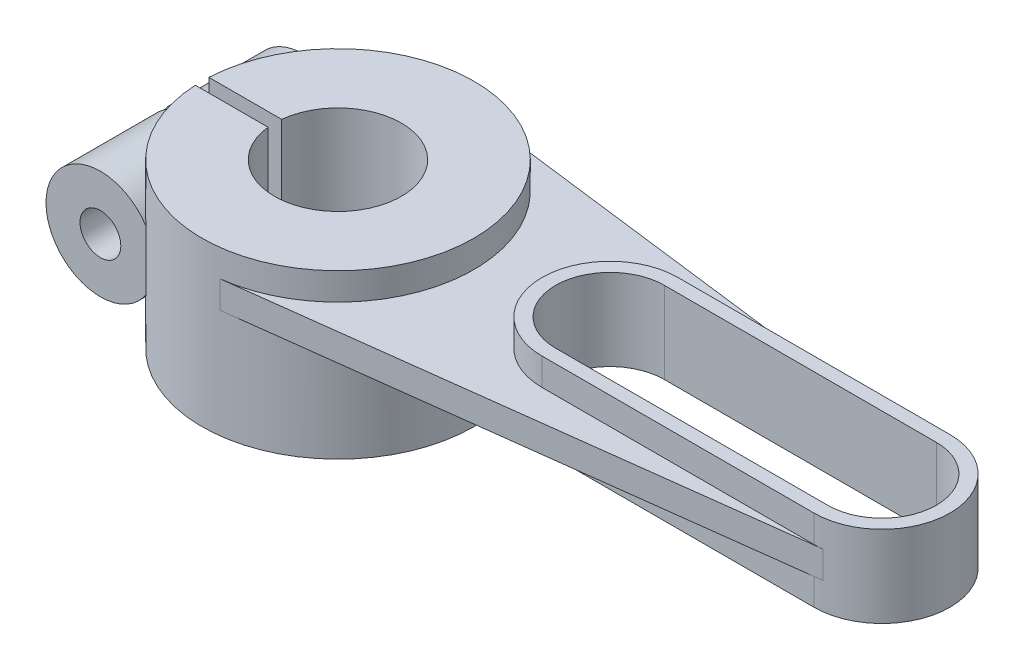
ISO-10303-21;
HEADER;
FILE_DESCRIPTION(('STEP AP214'),'2;1');
FILE_NAME('part.step','',(''),(''),'','','');
FILE_SCHEMA(('AUTOMOTIVE_DESIGN { 1 0 10303 214 1 1 1 1 }'));
ENDSEC;
DATA;
#1=APPLICATION_CONTEXT('core data for automotive mechanical design processes');
#2=APPLICATION_PROTOCOL_DEFINITION('international standard','automotive_design',2000,#1);
#3=PRODUCT_CONTEXT('',#1,'mechanical');
#4=PRODUCT('Part','Part','',(#3));
#5=PRODUCT_RELATED_PRODUCT_CATEGORY('part','',(#4));
#6=PRODUCT_DEFINITION_FORMATION('','',#4);
#7=PRODUCT_DEFINITION_CONTEXT('part definition',#1,'design');
#8=PRODUCT_DEFINITION('design','',#6,#7);
#9=PRODUCT_DEFINITION_SHAPE('','',#8);
#10=(LENGTH_UNIT() NAMED_UNIT(*) SI_UNIT(.MILLI.,.METRE.));
#11=(NAMED_UNIT(*) PLANE_ANGLE_UNIT() SI_UNIT($,.RADIAN.));
#12=(NAMED_UNIT(*) SI_UNIT($,.STERADIAN.) SOLID_ANGLE_UNIT());
#13=UNCERTAINTY_MEASURE_WITH_UNIT(LENGTH_MEASURE(1.E-05),#10,'distance_accuracy_value','');
#14=(GEOMETRIC_REPRESENTATION_CONTEXT(3) GLOBAL_UNCERTAINTY_ASSIGNED_CONTEXT((#13)) GLOBAL_UNIT_ASSIGNED_CONTEXT((#10,
#11,#12)) REPRESENTATION_CONTEXT('',''));
#15=CARTESIAN_POINT('',(0.,0.,0.));
#16=DIRECTION('',(0.,0.,1.));
#17=DIRECTION('',(1.,0.,0.));
#18=AXIS2_PLACEMENT_3D('',#15,#16,#17);
#19=CARTESIAN_POINT('',(-30.,18.,22.4));
#20=DIRECTION('',(0.,0.,-1.));
#21=DIRECTION('',(-1.,0.,0.));
#22=AXIS2_PLACEMENT_3D('',#19,#20,#21);
#23=CYLINDRICAL_SURFACE('',#22,12.);
#24=CARTESIAN_POINT('',(-19.9559514932263,11.4336395473918,-22.4));
#25=CARTESIAN_POINT('',(-20.0452582012227,11.2970301761876,-22.3204385373501));
#26=CARTESIAN_POINT('',(-20.1365950513194,11.1634092411533,-22.238107892658));
#27=CARTESIAN_POINT('',(-20.3228226930156,10.9022574373812,-22.0680487426671));
#28=CARTESIAN_POINT('',(-20.4177128747661,10.7747255320699,-21.9803211619836));
#29=CARTESIAN_POINT('',(-20.7066582604345,10.4018070637896,-21.7095327670615));
#30=CARTESIAN_POINT('',(-20.9053092688414,10.1656115426502,-21.5185825524336));
#31=CARTESIAN_POINT('',(-21.3083309167039,9.7208719185652,-21.1195294255769));
#32=CARTESIAN_POINT('',(-21.5126073148942,9.51203635326896,-20.9116536064861));
#33=CARTESIAN_POINT('',(-21.9255911901237,9.11825635699474,-20.4782353851547));
#34=CARTESIAN_POINT('',(-22.1343006495536,8.93332288816663,-20.2526849524926));
#35=CARTESIAN_POINT('',(-22.6034039518305,8.54461857493489,-19.7291040263861));
#36=CARTESIAN_POINT('',(-22.8641093806953,8.34708106511016,-19.4267225647663));
#37=CARTESIAN_POINT('',(-23.3820270280337,7.98489319902094,-18.8001641422713));
#38=CARTESIAN_POINT('',(-23.6392386640591,7.82024826503855,-18.4759835996101));
#39=CARTESIAN_POINT('',(-24.1471063664777,7.51996872368522,-17.8071423927111));
#40=CARTESIAN_POINT('',(-24.3977291066971,7.38446322714123,-17.4623988900491));
#41=CARTESIAN_POINT('',(-24.8880770222335,7.13982840909984,-16.7561533055842));
#42=CARTESIAN_POINT('',(-25.1277985152076,7.03070794727717,-16.3946456430702));
#43=CARTESIAN_POINT('',(-25.7019852026795,6.78999989106908,-15.485971078752));
#44=CARTESIAN_POINT('',(-26.0288044993074,6.67147821459324,-14.9304846304652));
#45=CARTESIAN_POINT('',(-26.6484372774617,6.47294889785119,-13.7942120500885));
#46=CARTESIAN_POINT('',(-26.9412345683522,6.39295953812381,-13.2134140518711));
#47=CARTESIAN_POINT('',(-27.489653276516,6.26212688706807,-12.0309605421526));
#48=CARTESIAN_POINT('',(-27.7452489957032,6.21130367246612,-11.4292909649454));
#49=CARTESIAN_POINT('',(-28.2169234039508,6.13080233242647,-10.2094534599521));
#50=CARTESIAN_POINT('',(-28.4330066781523,6.10112175237594,-9.59128745601248));
#51=CARTESIAN_POINT('',(-28.833847412757,6.05501096473799,-8.31146166792504));
#52=CARTESIAN_POINT('',(-29.0165838357416,6.03929119630611,-7.64914446314335));
#53=CARTESIAN_POINT('',(-29.3362014359853,6.01730295475187,-6.31339295073811));
#54=CARTESIAN_POINT('',(-29.4730813841859,6.0110347349369,-5.63995834565029));
#55=CARTESIAN_POINT('',(-29.7002604804233,6.00320623317468,-4.28554479599617));
#56=CARTESIAN_POINT('',(-29.7905780537161,6.0016440877937,-3.6045689447195));
#57=CARTESIAN_POINT('',(-29.9242875803539,6.00004975526594,-2.23793242836965));
#58=CARTESIAN_POINT('',(-29.9676764787147,6.00001766771769,-1.5522714612262));
#59=CARTESIAN_POINT('',(-29.9995527472474,5.99999972866875,-0.448641155406846));
#60=CARTESIAN_POINT('',(-30.0028899432299,6.00000068763925,-0.0310430901240505));
#61=CARTESIAN_POINT('',(-29.9921315061391,5.99999982868017,0.803960477312719));
#62=CARTESIAN_POINT('',(-29.9780352886658,5.99999801065749,1.22136597254216));
#63=CARTESIAN_POINT('',(-29.9324266260863,6.00016901193162,2.0553020260632));
#64=CARTESIAN_POINT('',(-29.9009107522923,6.00034186561438,2.4718323958983));
#65=CARTESIAN_POINT('',(-29.8205165853553,6.00127491234794,3.30321018006637));
#66=CARTESIAN_POINT('',(-29.7716384888462,6.0020350987471,3.71805761340542));
#67=CARTESIAN_POINT('',(-29.65655630144,6.00477755977339,4.54569843893734));
#68=CARTESIAN_POINT('',(-29.5903375213639,6.00676087244205,4.95848978588433));
#69=CARTESIAN_POINT('',(-29.4407111072366,6.01280682870637,5.78093747109574));
#70=CARTESIAN_POINT('',(-29.3573031857202,6.01686950707828,6.19059375681166));
#71=CARTESIAN_POINT('',(-29.1734720249141,6.02814398587126,7.0059343191592));
#72=CARTESIAN_POINT('',(-29.0730527686826,6.03535504974685,7.41161950212415));
#73=CARTESIAN_POINT('',(-28.8553965006917,6.05421464100735,8.21831220732344));
#74=CARTESIAN_POINT('',(-28.7381603315472,6.06586294611178,8.61931996283335));
#75=CARTESIAN_POINT('',(-28.4181503918621,6.10309921262527,9.63468253461529));
#76=CARTESIAN_POINT('',(-28.2037555184108,6.1328293393569,10.2452800364704));
#77=CARTESIAN_POINT('',(-27.7364395366822,6.21303817135797,11.4502166666845));
#78=CARTESIAN_POINT('',(-27.4835173321517,6.26351746709181,12.0445553318482));
#79=CARTESIAN_POINT('',(-26.941567958188,6.39295396335626,13.2123267456398));
#80=CARTESIAN_POINT('',(-26.6525971363205,6.47186707478835,13.7857903553875));
#81=CARTESIAN_POINT('',(-26.0414404323119,6.66718559213263,14.9080836468413));
#82=CARTESIAN_POINT('',(-25.7192697350663,6.78357390900358,15.4569244270638));
#83=CARTESIAN_POINT('',(-25.1612240634795,7.01619888425048,16.3427773776949));
#84=CARTESIAN_POINT('',(-24.9332726458105,7.11902002483009,16.6883395471064));
#85=CARTESIAN_POINT('',(-24.467255617537,7.34841861057035,17.3643814515647));
#86=CARTESIAN_POINT('',(-24.2291930607386,7.4749889218334,17.6948656788374));
#87=CARTESIAN_POINT('',(-23.7465369700842,7.75443253703559,18.3374716056392));
#88=CARTESIAN_POINT('',(-23.5019710779578,7.90720607139662,18.649657140152));
#89=CARTESIAN_POINT('',(-23.0089290191056,8.24224774441922,19.2546456784715));
#90=CARTESIAN_POINT('',(-22.7604529041615,8.42451549279576,19.5474489386837));
#91=CARTESIAN_POINT('',(-22.2888665665926,8.80108244886186,20.0828452659416));
#92=CARTESIAN_POINT('',(-22.0657109780721,8.99234297684437,20.3275290871496));
#93=CARTESIAN_POINT('',(-21.6236582727601,9.4018817040801,20.7971473795426));
#94=CARTESIAN_POINT('',(-21.4047592170782,9.62014725207788,21.022091014778));
#95=CARTESIAN_POINT('',(-20.9726267991639,10.0874161606422,21.4532803008353));
#96=CARTESIAN_POINT('',(-20.7595009396644,10.336775230611,21.6592516795288));
#97=CARTESIAN_POINT('',(-20.449846682443,10.7320771075303,21.9504891650744));
#98=CARTESIAN_POINT('',(-20.348201934665,10.8675381623528,22.0447025680026));
#99=CARTESIAN_POINT('',(-20.1489174508643,11.1454089763548,22.2269963092864));
#100=CARTESIAN_POINT('',(-20.0512785490931,11.287820169574,22.3150753727512));
#101=CARTESIAN_POINT('',(-19.9559514932263,11.4336395473918,22.4));
#102=B_SPLINE_CURVE_WITH_KNOTS('',3,(#24,#25,#26,#27,#28,#29,#30,#31,#32,#33,#34,#35,#36,#37,
#38,#39,#40,#41,#42,#43,#44,#45,#46,#47,#48,#49,#50,#51,#52,#53,#54,#55,#56,#57,#58,#59,#60,#61,
#62,#63,#64,#65,#66,#67,#68,#69,#70,#71,#72,#73,#74,#75,#76,#77,#78,#79,#80,#81,#82,#83,#84,#85,
#86,#87,#88,#89,#90,#91,#92,#93,#94,#95,#96,#97,#98,#99,#100,#101),.UNSPECIFIED.,.F.,.F.,(4,2,2,
2,2,2,2,2,2,2,2,2,2,2,2,2,2,2,2,2,2,2,2,2,2,2,2,2,2,2,2,2,2,2,2,2,2,2,4),(0.,0.544587845418776,
1.08908264925174,2.17613642194966,3.25045822261801,4.32527100112562,5.6596026418807,
6.99415406363866,8.33450203423285,9.67529944927164,11.6381837866678,13.6019984426493,
15.5671632881239,17.5320999451313,19.592089883536,21.6521350299688,23.7113643664206,
25.7707277474512,27.0232407234044,28.2757956870238,29.5285972772208,30.7813846794073,
32.0352367618369,33.2891098149463,34.5426896891838,35.7962067744696,37.7380191167593,
39.679886721524,41.6187561590614,43.5567427033508,44.8355049588019,46.1138837062519,
47.3874988653074,48.6610971725058,49.8069982774329,50.9523645713529,52.1123017183334,
52.6934636497102,53.2747460049003),.UNSPECIFIED.);
#103=CARTESIAN_POINT('',(-19.9559514932263,11.4336395473918,-22.4));
#104=VERTEX_POINT('',#103);
#105=CARTESIAN_POINT('',(-29.9624765331573,6.00005866725024,-1.5));
#106=VERTEX_POINT('',#105);
#107=EDGE_CURVE('E289',#104,#106,#102,.T.);
#108=ORIENTED_EDGE('',*,*,#107,.T.);
#109=CARTESIAN_POINT('',(-30.,18.,-1.5));
#110=DIRECTION('',(0.,0.,-1.));
#111=DIRECTION('',(-1.,0.,0.));
#112=AXIS2_PLACEMENT_3D('',#109,#110,#111);
#113=CIRCLE('',#112,12.);
#114=CARTESIAN_POINT('',(-29.9624765331573,29.9999413327498,-1.5));
#115=VERTEX_POINT('',#114);
#116=EDGE_CURVE('E11',#106,#115,#113,.T.);
#117=ORIENTED_EDGE('',*,*,#116,.T.);
#118=CARTESIAN_POINT('',(-19.9559514932263,24.5663604526082,22.4));
#119=CARTESIAN_POINT('',(-20.0452582012227,24.7029698238124,22.3204385373501));
#120=CARTESIAN_POINT('',(-20.1365950513194,24.8365907588467,22.238107892658));
#121=CARTESIAN_POINT('',(-20.3228226930156,25.0977425626188,22.0680487426671));
#122=CARTESIAN_POINT('',(-20.4177128747661,25.2252744679301,21.9803211619836));
#123=CARTESIAN_POINT('',(-20.7066582604345,25.5981929362104,21.7095327670615));
#124=CARTESIAN_POINT('',(-20.9053092688414,25.8343884573497,21.5185825524336));
#125=CARTESIAN_POINT('',(-21.3083309167039,26.2791280814348,21.1195294255769));
#126=CARTESIAN_POINT('',(-21.5126073148942,26.487963646731,20.9116536064861));
#127=CARTESIAN_POINT('',(-21.9255911901237,26.8817436430053,20.4782353851547));
#128=CARTESIAN_POINT('',(-22.1343006495536,27.0666771118334,20.2526849524926));
#129=CARTESIAN_POINT('',(-22.6034039518305,27.4553814250651,19.7291040263861));
#130=CARTESIAN_POINT('',(-22.8641093806953,27.6529189348898,19.4267225647663));
#131=CARTESIAN_POINT('',(-23.3820270280337,28.0151068009791,18.8001641422713));
#132=CARTESIAN_POINT('',(-23.6392386640591,28.1797517349614,18.4759835996101));
#133=CARTESIAN_POINT('',(-24.1471063664777,28.4800312763148,17.8071423927111));
#134=CARTESIAN_POINT('',(-24.3977291066971,28.6155367728588,17.4623988900491));
#135=CARTESIAN_POINT('',(-24.8880770222335,28.8601715909001,16.7561533055842));
#136=CARTESIAN_POINT('',(-25.1277985152076,28.9692920527228,16.3946456430702));
#137=CARTESIAN_POINT('',(-25.7019852026795,29.2100001089309,15.485971078752));
#138=CARTESIAN_POINT('',(-26.0288044993074,29.3285217854068,14.9304846304652));
#139=CARTESIAN_POINT('',(-26.6484372774617,29.5270511021488,13.7942120500885));
#140=CARTESIAN_POINT('',(-26.9412345683522,29.6070404618762,13.2134140518711));
#141=CARTESIAN_POINT('',(-27.489653276516,29.7378731129319,12.0309605421526));
#142=CARTESIAN_POINT('',(-27.7452489957032,29.7886963275339,11.4292909649454));
#143=CARTESIAN_POINT('',(-28.2169234039508,29.8691976675735,10.2094534599521));
#144=CARTESIAN_POINT('',(-28.4330066781523,29.8988782476241,9.59128745601248));
#145=CARTESIAN_POINT('',(-28.833847412757,29.944989035262,8.31146166792505));
#146=CARTESIAN_POINT('',(-29.0165838357416,29.9607088036939,7.64914446314336));
#147=CARTESIAN_POINT('',(-29.3362014359852,29.9826970452481,6.31339295073811));
#148=CARTESIAN_POINT('',(-29.4730813841859,29.9889652650631,5.6399583456503));
#149=CARTESIAN_POINT('',(-29.7002604804233,29.9967937668253,4.28554479599618));
#150=CARTESIAN_POINT('',(-29.7905780537161,29.9983559122063,3.60456894471951));
#151=CARTESIAN_POINT('',(-29.9242875803539,29.9999502447341,2.23793242836967));
#152=CARTESIAN_POINT('',(-29.9676764787147,29.9999823322823,1.55227146122622));
#153=CARTESIAN_POINT('',(-29.9995527472474,30.0000002713312,0.448641155406861));
#154=CARTESIAN_POINT('',(-30.0028899432299,29.9999993123607,0.0310430901240644));
#155=CARTESIAN_POINT('',(-29.9921315061391,30.0000001713198,-0.803960477312706));
#156=CARTESIAN_POINT('',(-29.9780352886658,30.0000019893425,-1.22136597254215));
#157=CARTESIAN_POINT('',(-29.9324266260863,29.9998309880684,-2.05530202606319));
#158=CARTESIAN_POINT('',(-29.9009107522923,29.9996581343856,-2.47183239589829));
#159=CARTESIAN_POINT('',(-29.8205165853553,29.9987250876521,-3.30321018006635));
#160=CARTESIAN_POINT('',(-29.7716384888462,29.9979649012529,-3.7180576134054));
#161=CARTESIAN_POINT('',(-29.65655630144,29.9952224402266,-4.54569843893732));
#162=CARTESIAN_POINT('',(-29.5903375213639,29.9932391275579,-4.95848978588432));
#163=CARTESIAN_POINT('',(-29.4407111072366,29.9871931712936,-5.78093747109573));
#164=CARTESIAN_POINT('',(-29.3573031857202,29.9831304929217,-6.19059375681165));
#165=CARTESIAN_POINT('',(-29.1734720249141,29.9718560141287,-7.00593431915919));
#166=CARTESIAN_POINT('',(-29.0730527686826,29.9646449502532,-7.41161950212414));
#167=CARTESIAN_POINT('',(-28.8553965006917,29.9457853589926,-8.21831220732342));
#168=CARTESIAN_POINT('',(-28.7381603315472,29.9341370538882,-8.61931996283333));
#169=CARTESIAN_POINT('',(-28.4181503918621,29.8969007873747,-9.63468253461527));
#170=CARTESIAN_POINT('',(-28.2037555184108,29.8671706606431,-10.2452800364704));
#171=CARTESIAN_POINT('',(-27.7364395366822,29.786961828642,-11.4502166666845));
#172=CARTESIAN_POINT('',(-27.4835173321517,29.7364825329082,-12.0445553318482));
#173=CARTESIAN_POINT('',(-26.941567958188,29.6070460366437,-13.2123267456398));
#174=CARTESIAN_POINT('',(-26.6525971363205,29.5281329252116,-13.7857903553875));
#175=CARTESIAN_POINT('',(-26.0414404323119,29.3328144078674,-14.9080836468413));
#176=CARTESIAN_POINT('',(-25.7192697350663,29.2164260909964,-15.4569244270638));
#177=CARTESIAN_POINT('',(-25.1612240634795,28.9838011157495,-16.3427773776949));
#178=CARTESIAN_POINT('',(-24.9332726458105,28.8809799751699,-16.6883395471064));
#179=CARTESIAN_POINT('',(-24.467255617537,28.6515813894296,-17.3643814515647));
#180=CARTESIAN_POINT('',(-24.2291930607386,28.5250110781666,-17.6948656788374));
#181=CARTESIAN_POINT('',(-23.7465369700842,28.2455674629644,-18.3374716056392));
#182=CARTESIAN_POINT('',(-23.5019710779578,28.0927939286034,-18.649657140152));
#183=CARTESIAN_POINT('',(-23.0089290191056,27.7577522555808,-19.2546456784715));
#184=CARTESIAN_POINT('',(-22.7604529041615,27.5754845072042,-19.5474489386837));
#185=CARTESIAN_POINT('',(-22.2888665665926,27.1989175511381,-20.0828452659416));
#186=CARTESIAN_POINT('',(-22.0657109780721,27.0076570231556,-20.3275290871496));
#187=CARTESIAN_POINT('',(-21.6236582727601,26.5981182959199,-20.7971473795426));
#188=CARTESIAN_POINT('',(-21.4047592170782,26.3798527479221,-21.022091014778));
#189=CARTESIAN_POINT('',(-20.9726267991639,25.9125838393578,-21.4532803008353));
#190=CARTESIAN_POINT('',(-20.7595009396644,25.663224769389,-21.6592516795288));
#191=CARTESIAN_POINT('',(-20.449846682443,25.2679228924697,-21.9504891650744));
#192=CARTESIAN_POINT('',(-20.348201934665,25.1324618376472,-22.0447025680026));
#193=CARTESIAN_POINT('',(-20.1489174508643,24.8545910236452,-22.2269963092864));
#194=CARTESIAN_POINT('',(-20.0512785490931,24.712179830426,-22.3150753727512));
#195=CARTESIAN_POINT('',(-19.9559514932263,24.5663604526082,-22.4));
#196=B_SPLINE_CURVE_WITH_KNOTS('',3,(#118,#119,#120,#121,#122,#123,#124,#125,#126,#127,#128,
#129,#130,#131,#132,#133,#134,#135,#136,#137,#138,#139,#140,#141,#142,#143,#144,#145,#146,#147,
#148,#149,#150,#151,#152,#153,#154,#155,#156,#157,#158,#159,#160,#161,#162,#163,#164,#165,#166,
#167,#168,#169,#170,#171,#172,#173,#174,#175,#176,#177,#178,#179,#180,#181,#182,#183,#184,#185,
#186,#187,#188,#189,#190,#191,#192,#193,#194,#195),.UNSPECIFIED.,.F.,.F.,(4,2,2,2,2,2,2,2,2,2,2,
2,2,2,2,2,2,2,2,2,2,2,2,2,2,2,2,2,2,2,2,2,2,2,2,2,2,2,4),(0.,0.544587845418774,1.08908264925174,
2.17613642194966,3.25045822261801,4.32527100112562,5.65960264188069,6.99415406363865,
8.33450203423284,9.67529944927164,11.6381837866678,13.6019984426493,15.5671632881239,
17.5320999451313,19.592089883536,21.6521350299688,23.7113643664205,25.7707277474512,
27.0232407234044,28.2757956870238,29.5285972772208,30.7813846794072,32.0352367618369,
33.2891098149462,34.5426896891838,35.7962067744696,37.7380191167593,39.6798867215239,
41.6187561590614,43.5567427033508,44.8355049588019,46.1138837062519,47.3874988653074,
48.6610971725058,49.8069982774329,50.9523645713529,52.1123017183334,52.6934636497102,
53.2747460049003),.UNSPECIFIED.);
#197=CARTESIAN_POINT('',(-19.9559514932263,24.5663604526082,-22.4));
#198=VERTEX_POINT('',#197);
#199=EDGE_CURVE('E298',#115,#198,#196,.T.);
#200=ORIENTED_EDGE('',*,*,#199,.T.);
#201=CARTESIAN_POINT('',(-30.,18.,-22.4));
#202=DIRECTION('',(0.,0.,1.));
#203=DIRECTION('',(1.,0.,0.));
#204=AXIS2_PLACEMENT_3D('',#201,#202,#203);
#205=CIRCLE('',#204,12.);
#206=EDGE_CURVE('E391',#198,#104,#205,.T.);
#207=ORIENTED_EDGE('',*,*,#206,.T.);
#208=EDGE_LOOP('',(#108,#117,#200,#207));
#209=FACE_BOUND('',#208,.T.);
#210=ADVANCED_FACE('F45',(#209),#23,.T.);
#211=CARTESIAN_POINT('',(0.,36.,0.));
#212=DIRECTION('',(0.,-1.,0.));
#213=DIRECTION('',(0.,0.,-1.));
#214=AXIS2_PLACEMENT_3D('',#211,#212,#213);
#215=CYLINDRICAL_SURFACE('',#214,30.);
#216=CARTESIAN_POINT('',(0.,0.,0.));
#217=DIRECTION('',(0.,1.,0.));
#218=DIRECTION('',(0.,0.,1.));
#219=AXIS2_PLACEMENT_3D('',#216,#217,#218);
#220=CIRCLE('',#219,30.);
#221=CARTESIAN_POINT('',(-29.9624765331573,0.,1.50000000000001));
#222=VERTEX_POINT('',#221);
#223=CARTESIAN_POINT('',(-29.9624765331573,0.,-1.5));
#224=VERTEX_POINT('',#223);
#225=EDGE_CURVE('E227',#222,#224,#220,.T.);
#226=ORIENTED_EDGE('',*,*,#225,.T.);
#227=DIRECTION('',(0.,-1.,0.));
#228=VECTOR('',#227,1.);
#229=CARTESIAN_POINT('',(-29.9624765331573,36.,-1.5));
#230=LINE('',#229,#228);
#231=EDGE_CURVE('E395',#224,#106,#230,.F.);
#232=ORIENTED_EDGE('',*,*,#231,.T.);
#233=ORIENTED_EDGE('',*,*,#107,.F.);
#234=DIRECTION('',(0.,-1.,0.));
#235=VECTOR('',#234,1.);
#236=CARTESIAN_POINT('',(-19.9559514932263,36.,-22.4));
#237=LINE('',#236,#235);
#238=EDGE_CURVE('E284',#198,#104,#237,.T.);
#239=ORIENTED_EDGE('',*,*,#238,.F.);
#240=ORIENTED_EDGE('',*,*,#199,.F.);
#241=CARTESIAN_POINT('',(-29.9624765331573,36.,-1.5));
#242=VERTEX_POINT('',#241);
#243=EDGE_CURVE('E71',#115,#242,#230,.F.);
#244=ORIENTED_EDGE('',*,*,#243,.T.);
#245=CARTESIAN_POINT('',(0.,36.,0.));
#246=DIRECTION('',(0.,1.,0.));
#247=DIRECTION('',(0.,0.,1.));
#248=AXIS2_PLACEMENT_3D('',#245,#246,#247);
#249=CIRCLE('',#248,30.);
#250=CARTESIAN_POINT('',(-29.9624765331573,36.,1.50000000000001));
#251=VERTEX_POINT('',#250);
#252=EDGE_CURVE('E245',#251,#242,#249,.T.);
#253=ORIENTED_EDGE('',*,*,#252,.F.);
#254=DIRECTION('',(0.,-1.,0.));
#255=VECTOR('',#254,1.);
#256=CARTESIAN_POINT('',(-29.9624765331573,36.,1.50000000000001));
#257=LINE('',#256,#255);
#258=CARTESIAN_POINT('',(-29.9624765331573,29.9999413327498,1.5));
#259=VERTEX_POINT('',#258);
#260=EDGE_CURVE('E617',#251,#259,#257,.T.);
#261=ORIENTED_EDGE('',*,*,#260,.T.);
#262=CARTESIAN_POINT('',(-19.9559514932263,24.5663604526082,22.4));
#263=VERTEX_POINT('',#262);
#264=EDGE_CURVE('E299',#263,#259,#196,.T.);
#265=ORIENTED_EDGE('',*,*,#264,.F.);
#266=DIRECTION('',(0.,-1.,0.));
#267=VECTOR('',#266,1.);
#268=CARTESIAN_POINT('',(-19.9559514932263,36.,22.4));
#269=LINE('',#268,#267);
#270=CARTESIAN_POINT('',(-19.9559514932263,11.4336395473918,22.4));
#271=VERTEX_POINT('',#270);
#272=EDGE_CURVE('E562',#263,#271,#269,.T.);
#273=ORIENTED_EDGE('',*,*,#272,.T.);
#274=CARTESIAN_POINT('',(-29.9624765331573,6.00005866725024,1.5));
#275=VERTEX_POINT('',#274);
#276=EDGE_CURVE('E288',#275,#271,#102,.T.);
#277=ORIENTED_EDGE('',*,*,#276,.F.);
#278=EDGE_CURVE('E63',#275,#222,#257,.T.);
#279=ORIENTED_EDGE('',*,*,#278,.T.);
#280=EDGE_LOOP('',(#226,#232,#233,#239,#240,#244,#253,#261,#265,#273,#277,#279));
#281=FACE_BOUND('',#280,.T.);
#282=CARTESIAN_POINT('',(0.,24.,0.));
#283=DIRECTION('',(0.,-1.,0.));
#284=DIRECTION('',(0.,0.,1.));
#285=AXIS2_PLACEMENT_3D('',#282,#283,#284);
#286=CIRCLE('',#285,30.);
#287=CARTESIAN_POINT('',(3.75,24.,-29.7647022494766));
#288=VERTEX_POINT('',#287);
#289=CARTESIAN_POINT('',(3.75,24.,29.7647022494766));
#290=VERTEX_POINT('',#289);
#291=EDGE_CURVE('E502',#288,#290,#286,.T.);
#292=ORIENTED_EDGE('',*,*,#291,.T.);
#293=DIRECTION('',(0.,1.,0.));
#294=VECTOR('',#293,1.);
#295=CARTESIAN_POINT('',(3.75,24.,29.7647022494766));
#296=LINE('',#295,#294);
#297=CARTESIAN_POINT('',(3.75,30.,29.7647022494766));
#298=VERTEX_POINT('',#297);
#299=EDGE_CURVE('E515',#290,#298,#296,.T.);
#300=ORIENTED_EDGE('',*,*,#299,.T.);
#301=CARTESIAN_POINT('',(0.,30.,0.));
#302=DIRECTION('',(0.,-1.,0.));
#303=DIRECTION('',(0.,0.,1.));
#304=AXIS2_PLACEMENT_3D('',#301,#302,#303);
#305=CIRCLE('',#304,30.);
#306=CARTESIAN_POINT('',(3.75,30.,-29.7647022494766));
#307=VERTEX_POINT('',#306);
#308=EDGE_CURVE('E501',#307,#298,#305,.T.);
#309=ORIENTED_EDGE('',*,*,#308,.F.);
#310=DIRECTION('',(0.,1.,0.));
#311=VECTOR('',#310,1.);
#312=CARTESIAN_POINT('',(3.75,24.,-29.7647022494766));
#313=LINE('',#312,#311);
#314=EDGE_CURVE('E235',#288,#307,#313,.T.);
#315=ORIENTED_EDGE('',*,*,#314,.F.);
#316=EDGE_LOOP('',(#292,#300,#309,#315));
#317=FACE_BOUND('',#316,.T.);
#318=ADVANCED_FACE('F47',(#281,#317),#215,.T.);
#319=CARTESIAN_POINT('',(0.,36.,0.));
#320=DIRECTION('',(0.,1.,0.));
#321=DIRECTION('',(0.,0.,1.));
#322=AXIS2_PLACEMENT_3D('',#319,#320,#321);
#323=PLANE('',#322);
#324=DIRECTION('',(-1.,0.,0.));
#325=VECTOR('',#324,1.);
#326=CARTESIAN_POINT('',(-45.,36.,-1.49999999999999));
#327=LINE('',#326,#325);
#328=CARTESIAN_POINT('',(-13.9194109070751,36.,-1.5));
#329=VERTEX_POINT('',#328);
#330=EDGE_CURVE('E229',#329,#242,#327,.T.);
#331=ORIENTED_EDGE('',*,*,#330,.F.);
#332=CARTESIAN_POINT('',(0.,36.,0.));
#333=DIRECTION('',(0.,1.,0.));
#334=DIRECTION('',(0.,0.,1.));
#335=AXIS2_PLACEMENT_3D('',#332,#333,#334);
#336=CIRCLE('',#335,14.);
#337=CARTESIAN_POINT('',(-13.9194109070751,36.,1.5));
#338=VERTEX_POINT('',#337);
#339=EDGE_CURVE('E234',#338,#329,#336,.T.);
#340=ORIENTED_EDGE('',*,*,#339,.F.);
#341=DIRECTION('',(1.,0.,0.));
#342=VECTOR('',#341,1.);
#343=CARTESIAN_POINT('',(-45.,36.,1.50000000000001));
#344=LINE('',#343,#342);
#345=EDGE_CURVE('E211',#251,#338,#344,.T.);
#346=ORIENTED_EDGE('',*,*,#345,.F.);
#347=ORIENTED_EDGE('',*,*,#252,.T.);
#348=EDGE_LOOP('',(#331,#340,#346,#347));
#349=FACE_BOUND('',#348,.T.);
#350=ADVANCED_FACE('F376',(#349),#323,.T.);
#351=CARTESIAN_POINT('',(0.,0.,0.));
#352=DIRECTION('',(0.,1.,0.));
#353=DIRECTION('',(0.,0.,1.));
#354=AXIS2_PLACEMENT_3D('',#351,#352,#353);
#355=PLANE('',#354);
#356=CARTESIAN_POINT('',(0.,0.,0.));
#357=DIRECTION('',(0.,1.,0.));
#358=DIRECTION('',(0.,0.,1.));
#359=AXIS2_PLACEMENT_3D('',#356,#357,#358);
#360=CIRCLE('',#359,14.);
#361=CARTESIAN_POINT('',(-13.9194109070751,0.,1.5));
#362=VERTEX_POINT('',#361);
#363=CARTESIAN_POINT('',(-13.9194109070751,0.,-1.5));
#364=VERTEX_POINT('',#363);
#365=EDGE_CURVE('E225',#362,#364,#360,.T.);
#366=ORIENTED_EDGE('',*,*,#365,.T.);
#367=DIRECTION('',(-1.,0.,0.));
#368=VECTOR('',#367,1.);
#369=CARTESIAN_POINT('',(-45.,0.,-1.49999999999999));
#370=LINE('',#369,#368);
#371=EDGE_CURVE('E218',#364,#224,#370,.T.);
#372=ORIENTED_EDGE('',*,*,#371,.T.);
#373=ORIENTED_EDGE('',*,*,#225,.F.);
#374=DIRECTION('',(1.,0.,0.));
#375=VECTOR('',#374,1.);
#376=CARTESIAN_POINT('',(-45.,0.,1.50000000000001));
#377=LINE('',#376,#375);
#378=EDGE_CURVE('E209',#222,#362,#377,.T.);
#379=ORIENTED_EDGE('',*,*,#378,.T.);
#380=EDGE_LOOP('',(#366,#372,#373,#379));
#381=FACE_BOUND('',#380,.T.);
#382=ADVANCED_FACE('F223',(#381),#355,.F.);
#383=CARTESIAN_POINT('',(0.,36.,0.));
#384=DIRECTION('',(0.,-1.,0.));
#385=DIRECTION('',(0.,0.,-1.));
#386=AXIS2_PLACEMENT_3D('',#383,#384,#385);
#387=CYLINDRICAL_SURFACE('',#386,14.);
#388=DIRECTION('',(0.,1.,0.));
#389=VECTOR('',#388,1.);
#390=CARTESIAN_POINT('',(-13.9194109070751,0.,-1.5));
#391=LINE('',#390,#389);
#392=EDGE_CURVE('E217',#364,#329,#391,.T.);
#393=ORIENTED_EDGE('',*,*,#392,.F.);
#394=ORIENTED_EDGE('',*,*,#365,.F.);
#395=DIRECTION('',(0.,1.,0.));
#396=VECTOR('',#395,1.);
#397=CARTESIAN_POINT('',(-13.9194109070751,0.,1.5));
#398=LINE('',#397,#396);
#399=EDGE_CURVE('E206',#362,#338,#398,.T.);
#400=ORIENTED_EDGE('',*,*,#399,.T.);
#401=ORIENTED_EDGE('',*,*,#339,.T.);
#402=EDGE_LOOP('',(#393,#394,#400,#401));
#403=FACE_BOUND('',#402,.T.);
#404=ADVANCED_FACE('F232',(#403),#387,.F.);
#405=CARTESIAN_POINT('',(3.75,24.,-29.7647022494766));
#406=DIRECTION('',(0.125,0.,-0.992156741649221));
#407=DIRECTION('',(-0.992156741649222,0.,-0.125));
#408=AXIS2_PLACEMENT_3D('',#405,#406,#407);
#409=PLANE('',#408);
#410=DIRECTION('',(-0.992156741649222,0.,-0.125));
#411=VECTOR('',#410,1.);
#412=CARTESIAN_POINT('',(3.75,30.,-29.7647022494766));
#413=LINE('',#412,#411);
#414=CARTESIAN_POINT('',(121.875,30.,-14.8823511247383));
#415=VERTEX_POINT('',#414);
#416=EDGE_CURVE('E507',#415,#307,#413,.T.);
#417=ORIENTED_EDGE('',*,*,#416,.F.);
#418=DIRECTION('',(0.,1.,0.));
#419=VECTOR('',#418,1.);
#420=CARTESIAN_POINT('',(121.875,24.,-14.8823511247383));
#421=LINE('',#420,#419);
#422=CARTESIAN_POINT('',(121.875,24.,-14.8823511247383));
#423=VERTEX_POINT('',#422);
#424=EDGE_CURVE('E241',#423,#415,#421,.T.);
#425=ORIENTED_EDGE('',*,*,#424,.F.);
#426=DIRECTION('',(-0.992156741649222,0.,-0.125));
#427=VECTOR('',#426,1.);
#428=CARTESIAN_POINT('',(3.75,24.,-29.7647022494766));
#429=LINE('',#428,#427);
#430=EDGE_CURVE('E511',#423,#288,#429,.T.);
#431=ORIENTED_EDGE('',*,*,#430,.T.);
#432=ORIENTED_EDGE('',*,*,#314,.T.);
#433=EDGE_LOOP('',(#417,#425,#431,#432));
#434=FACE_BOUND('',#433,.T.);
#435=ADVANCED_FACE('F363',(#434),#409,.T.);
#436=CARTESIAN_POINT('',(120.,24.,0.));
#437=DIRECTION('',(0.,1.,0.));
#438=DIRECTION('',(0.,0.,1.));
#439=AXIS2_PLACEMENT_3D('',#436,#437,#438);
#440=CYLINDRICAL_SURFACE('',#439,15.);
#441=ORIENTED_EDGE('',*,*,#424,.T.);
#442=CARTESIAN_POINT('',(120.,30.,0.));
#443=DIRECTION('',(0.,1.,0.));
#444=DIRECTION('',(0.,0.,1.));
#445=AXIS2_PLACEMENT_3D('',#442,#443,#444);
#446=CIRCLE('',#445,15.);
#447=CARTESIAN_POINT('',(120.,30.,-15.));
#448=VERTEX_POINT('',#447);
#449=EDGE_CURVE('E260',#415,#448,#446,.T.);
#450=ORIENTED_EDGE('',*,*,#449,.T.);
#451=DIRECTION('',(0.,1.,0.));
#452=VECTOR('',#451,1.);
#453=CARTESIAN_POINT('',(120.,18.,-15.));
#454=LINE('',#453,#452);
#455=CARTESIAN_POINT('',(120.,36.,-15.));
#456=VERTEX_POINT('',#455);
#457=EDGE_CURVE('E477',#448,#456,#454,.T.);
#458=ORIENTED_EDGE('',*,*,#457,.T.);
#459=CARTESIAN_POINT('',(120.,36.,0.));
#460=DIRECTION('',(0.,1.,0.));
#461=DIRECTION('',(0.,0.,1.));
#462=AXIS2_PLACEMENT_3D('',#459,#460,#461);
#463=CIRCLE('',#462,15.);
#464=CARTESIAN_POINT('',(120.,36.,15.));
#465=VERTEX_POINT('',#464);
#466=EDGE_CURVE('E460',#465,#456,#463,.T.);
#467=ORIENTED_EDGE('',*,*,#466,.F.);
#468=DIRECTION('',(0.,1.,0.));
#469=VECTOR('',#468,1.);
#470=CARTESIAN_POINT('',(120.,18.,15.));
#471=LINE('',#470,#469);
#472=CARTESIAN_POINT('',(120.,30.,15.));
#473=VERTEX_POINT('',#472);
#474=EDGE_CURVE('E481',#473,#465,#471,.T.);
#475=ORIENTED_EDGE('',*,*,#474,.F.);
#476=CARTESIAN_POINT('',(121.875,30.,14.8823511247383));
#477=VERTEX_POINT('',#476);
#478=EDGE_CURVE('E255',#473,#477,#446,.T.);
#479=ORIENTED_EDGE('',*,*,#478,.T.);
#480=DIRECTION('',(0.,1.,0.));
#481=VECTOR('',#480,1.);
#482=CARTESIAN_POINT('',(121.875,24.,14.8823511247383));
#483=LINE('',#482,#481);
#484=CARTESIAN_POINT('',(121.875,24.,14.8823511247383));
#485=VERTEX_POINT('',#484);
#486=EDGE_CURVE('E528',#485,#477,#483,.T.);
#487=ORIENTED_EDGE('',*,*,#486,.F.);
#488=CARTESIAN_POINT('',(120.,24.,0.));
#489=DIRECTION('',(0.,1.,0.));
#490=DIRECTION('',(0.,0.,1.));
#491=AXIS2_PLACEMENT_3D('',#488,#489,#490);
#492=CIRCLE('',#491,15.);
#493=CARTESIAN_POINT('',(120.,24.,15.));
#494=VERTEX_POINT('',#493);
#495=EDGE_CURVE('E489',#494,#485,#492,.T.);
#496=ORIENTED_EDGE('',*,*,#495,.F.);
#497=CARTESIAN_POINT('',(120.,18.,15.));
#498=VERTEX_POINT('',#497);
#499=EDGE_CURVE('E478',#498,#494,#471,.T.);
#500=ORIENTED_EDGE('',*,*,#499,.F.);
#501=CARTESIAN_POINT('',(120.,18.,0.));
#502=DIRECTION('',(0.,1.,0.));
#503=DIRECTION('',(0.,0.,1.));
#504=AXIS2_PLACEMENT_3D('',#501,#502,#503);
#505=CIRCLE('',#504,15.);
#506=CARTESIAN_POINT('',(120.,18.,-15.));
#507=VERTEX_POINT('',#506);
#508=EDGE_CURVE('E444',#498,#507,#505,.T.);
#509=ORIENTED_EDGE('',*,*,#508,.T.);
#510=CARTESIAN_POINT('',(120.,24.,-15.));
#511=VERTEX_POINT('',#510);
#512=EDGE_CURVE('E473',#507,#511,#454,.T.);
#513=ORIENTED_EDGE('',*,*,#512,.T.);
#514=EDGE_CURVE('E492',#423,#511,#492,.T.);
#515=ORIENTED_EDGE('',*,*,#514,.F.);
#516=EDGE_LOOP('',(#441,#450,#458,#467,#475,#479,#487,#496,#500,#509,#513,#515));
#517=FACE_BOUND('',#516,.T.);
#518=ADVANCED_FACE('F366',(#517),#440,.T.);
#519=CARTESIAN_POINT('',(3.75,24.,29.7647022494766));
#520=DIRECTION('',(0.125,0.,0.992156741649221));
#521=DIRECTION('',(0.992156741649222,0.,-0.125));
#522=AXIS2_PLACEMENT_3D('',#519,#520,#521);
#523=PLANE('',#522);
#524=DIRECTION('',(0.992156741649222,0.,-0.125));
#525=VECTOR('',#524,1.);
#526=CARTESIAN_POINT('',(3.75,30.,29.7647022494766));
#527=LINE('',#526,#525);
#528=EDGE_CURVE('E519',#298,#477,#527,.T.);
#529=ORIENTED_EDGE('',*,*,#528,.F.);
#530=ORIENTED_EDGE('',*,*,#299,.F.);
#531=DIRECTION('',(0.992156741649222,0.,-0.125));
#532=VECTOR('',#531,1.);
#533=CARTESIAN_POINT('',(3.75,24.,29.7647022494766));
#534=LINE('',#533,#532);
#535=EDGE_CURVE('E506',#290,#485,#534,.T.);
#536=ORIENTED_EDGE('',*,*,#535,.T.);
#537=ORIENTED_EDGE('',*,*,#486,.T.);
#538=EDGE_LOOP('',(#529,#530,#536,#537));
#539=FACE_BOUND('',#538,.T.);
#540=ADVANCED_FACE('F358',(#539),#523,.T.);
#541=CARTESIAN_POINT('',(0.,24.,0.));
#542=DIRECTION('',(0.,1.,0.));
#543=DIRECTION('',(0.,0.,1.));
#544=AXIS2_PLACEMENT_3D('',#541,#542,#543);
#545=PLANE('',#544);
#546=ORIENTED_EDGE('',*,*,#430,.F.);
#547=ORIENTED_EDGE('',*,*,#514,.T.);
#548=DIRECTION('',(-1.,0.,0.));
#549=VECTOR('',#548,1.);
#550=CARTESIAN_POINT('',(0.,24.,-15.));
#551=LINE('',#550,#549);
#552=CARTESIAN_POINT('',(60.,24.,-15.));
#553=VERTEX_POINT('',#552);
#554=EDGE_CURVE('E493',#511,#553,#551,.T.);
#555=ORIENTED_EDGE('',*,*,#554,.T.);
#556=CARTESIAN_POINT('',(60.,24.,0.));
#557=DIRECTION('',(0.,1.,0.));
#558=DIRECTION('',(0.,0.,1.));
#559=AXIS2_PLACEMENT_3D('',#556,#557,#558);
#560=CIRCLE('',#559,15.);
#561=CARTESIAN_POINT('',(60.,24.,15.));
#562=VERTEX_POINT('',#561);
#563=EDGE_CURVE('E497',#553,#562,#560,.T.);
#564=ORIENTED_EDGE('',*,*,#563,.T.);
#565=DIRECTION('',(1.,0.,0.));
#566=VECTOR('',#565,1.);
#567=CARTESIAN_POINT('',(0.,24.,15.));
#568=LINE('',#567,#566);
#569=EDGE_CURVE('E471',#562,#494,#568,.T.);
#570=ORIENTED_EDGE('',*,*,#569,.T.);
#571=ORIENTED_EDGE('',*,*,#495,.T.);
#572=ORIENTED_EDGE('',*,*,#535,.F.);
#573=ORIENTED_EDGE('',*,*,#291,.F.);
#574=EDGE_LOOP('',(#546,#547,#555,#564,#570,#571,#572,#573));
#575=FACE_BOUND('',#574,.T.);
#576=ADVANCED_FACE('F355',(#575),#545,.F.);
#577=CARTESIAN_POINT('',(0.,30.,0.));
#578=DIRECTION('',(0.,1.,0.));
#579=DIRECTION('',(0.,0.,1.));
#580=AXIS2_PLACEMENT_3D('',#577,#578,#579);
#581=PLANE('',#580);
#582=ORIENTED_EDGE('',*,*,#449,.F.);
#583=ORIENTED_EDGE('',*,*,#416,.T.);
#584=ORIENTED_EDGE('',*,*,#308,.T.);
#585=ORIENTED_EDGE('',*,*,#528,.T.);
#586=ORIENTED_EDGE('',*,*,#478,.F.);
#587=DIRECTION('',(1.,0.,0.));
#588=VECTOR('',#587,1.);
#589=CARTESIAN_POINT('',(0.,30.,15.));
#590=LINE('',#589,#588);
#591=CARTESIAN_POINT('',(60.,30.,15.));
#592=VERTEX_POINT('',#591);
#593=EDGE_CURVE('E249',#592,#473,#590,.T.);
#594=ORIENTED_EDGE('',*,*,#593,.F.);
#595=CARTESIAN_POINT('',(60.,30.,0.));
#596=DIRECTION('',(0.,1.,0.));
#597=DIRECTION('',(0.,0.,1.));
#598=AXIS2_PLACEMENT_3D('',#595,#596,#597);
#599=CIRCLE('',#598,15.);
#600=CARTESIAN_POINT('',(60.,30.,-15.));
#601=VERTEX_POINT('',#600);
#602=EDGE_CURVE('E259',#601,#592,#599,.T.);
#603=ORIENTED_EDGE('',*,*,#602,.F.);
#604=DIRECTION('',(-1.,0.,0.));
#605=VECTOR('',#604,1.);
#606=CARTESIAN_POINT('',(0.,30.,-15.));
#607=LINE('',#606,#605);
#608=EDGE_CURVE('E264',#448,#601,#607,.T.);
#609=ORIENTED_EDGE('',*,*,#608,.F.);
#610=EDGE_LOOP('',(#582,#583,#584,#585,#586,#594,#603,#609));
#611=FACE_BOUND('',#610,.T.);
#612=ADVANCED_FACE('F340',(#611),#581,.T.);
#613=CARTESIAN_POINT('',(60.,36.,0.));
#614=DIRECTION('',(0.,1.,0.));
#615=DIRECTION('',(0.,0.,1.));
#616=AXIS2_PLACEMENT_3D('',#613,#614,#615);
#617=PLANE('',#616);
#618=CARTESIAN_POINT('',(60.,36.,0.));
#619=DIRECTION('',(0.,1.,0.));
#620=DIRECTION('',(0.,0.,1.));
#621=AXIS2_PLACEMENT_3D('',#618,#619,#620);
#622=CIRCLE('',#621,12.);
#623=CARTESIAN_POINT('',(60.,36.,-12.));
#624=VERTEX_POINT('',#623);
#625=CARTESIAN_POINT('',(60.,36.,12.));
#626=VERTEX_POINT('',#625);
#627=EDGE_CURVE('E403',#624,#626,#622,.T.);
#628=ORIENTED_EDGE('',*,*,#627,.F.);
#629=DIRECTION('',(-1.,0.,0.));
#630=VECTOR('',#629,1.);
#631=CARTESIAN_POINT('',(60.,36.,-12.));
#632=LINE('',#631,#630);
#633=CARTESIAN_POINT('',(120.,36.,-12.));
#634=VERTEX_POINT('',#633);
#635=EDGE_CURVE('E417',#634,#624,#632,.T.);
#636=ORIENTED_EDGE('',*,*,#635,.F.);
#637=CARTESIAN_POINT('',(120.,36.,0.));
#638=DIRECTION('',(0.,1.,0.));
#639=DIRECTION('',(0.,0.,1.));
#640=AXIS2_PLACEMENT_3D('',#637,#638,#639);
#641=CIRCLE('',#640,12.);
#642=CARTESIAN_POINT('',(120.,36.,12.));
#643=VERTEX_POINT('',#642);
#644=EDGE_CURVE('E413',#643,#634,#641,.T.);
#645=ORIENTED_EDGE('',*,*,#644,.F.);
#646=DIRECTION('',(1.,0.,0.));
#647=VECTOR('',#646,1.);
#648=CARTESIAN_POINT('',(60.,36.,12.));
#649=LINE('',#648,#647);
#650=EDGE_CURVE('E409',#626,#643,#649,.T.);
#651=ORIENTED_EDGE('',*,*,#650,.F.);
#652=EDGE_LOOP('',(#628,#636,#645,#651));
#653=FACE_BOUND('',#652,.T.);
#654=CARTESIAN_POINT('',(60.,36.,0.));
#655=DIRECTION('',(0.,1.,0.));
#656=DIRECTION('',(0.,0.,1.));
#657=AXIS2_PLACEMENT_3D('',#654,#655,#656);
#658=CIRCLE('',#657,15.);
#659=CARTESIAN_POINT('',(60.,36.,-15.));
#660=VERTEX_POINT('',#659);
#661=CARTESIAN_POINT('',(60.,36.,15.));
#662=VERTEX_POINT('',#661);
#663=EDGE_CURVE('E425',#660,#662,#658,.T.);
#664=ORIENTED_EDGE('',*,*,#663,.T.);
#665=DIRECTION('',(1.,0.,0.));
#666=VECTOR('',#665,1.);
#667=CARTESIAN_POINT('',(60.,36.,15.));
#668=LINE('',#667,#666);
#669=EDGE_CURVE('E456',#662,#465,#668,.T.);
#670=ORIENTED_EDGE('',*,*,#669,.T.);
#671=ORIENTED_EDGE('',*,*,#466,.T.);
#672=DIRECTION('',(-1.,0.,0.));
#673=VECTOR('',#672,1.);
#674=CARTESIAN_POINT('',(60.,36.,-15.));
#675=LINE('',#674,#673);
#676=EDGE_CURVE('E440',#456,#660,#675,.T.);
#677=ORIENTED_EDGE('',*,*,#676,.T.);
#678=EDGE_LOOP('',(#664,#670,#671,#677));
#679=FACE_BOUND('',#678,.T.);
#680=ADVANCED_FACE('F336',(#653,#679),#617,.T.);
#681=CARTESIAN_POINT('',(60.,18.,15.));
#682=DIRECTION('',(0.,0.,1.));
#683=DIRECTION('',(1.,0.,0.));
#684=AXIS2_PLACEMENT_3D('',#681,#682,#683);
#685=PLANE('',#684);
#686=DIRECTION('',(0.,1.,0.));
#687=VECTOR('',#686,1.);
#688=CARTESIAN_POINT('',(60.,18.,15.));
#689=LINE('',#688,#687);
#690=EDGE_CURVE('E452',#592,#662,#689,.T.);
#691=ORIENTED_EDGE('',*,*,#690,.F.);
#692=ORIENTED_EDGE('',*,*,#593,.T.);
#693=ORIENTED_EDGE('',*,*,#474,.T.);
#694=ORIENTED_EDGE('',*,*,#669,.F.);
#695=EDGE_LOOP('',(#691,#692,#693,#694));
#696=FACE_BOUND('',#695,.T.);
#697=ADVANCED_FACE('F339',(#696),#685,.T.);
#698=CARTESIAN_POINT('',(60.,18.,-15.));
#699=DIRECTION('',(0.,0.,-1.));
#700=DIRECTION('',(-1.,0.,0.));
#701=AXIS2_PLACEMENT_3D('',#698,#699,#700);
#702=PLANE('',#701);
#703=ORIENTED_EDGE('',*,*,#457,.F.);
#704=ORIENTED_EDGE('',*,*,#608,.T.);
#705=DIRECTION('',(0.,1.,0.));
#706=VECTOR('',#705,1.);
#707=CARTESIAN_POINT('',(60.,18.,-15.));
#708=LINE('',#707,#706);
#709=EDGE_CURVE('E472',#601,#660,#708,.T.);
#710=ORIENTED_EDGE('',*,*,#709,.T.);
#711=ORIENTED_EDGE('',*,*,#676,.F.);
#712=EDGE_LOOP('',(#703,#704,#710,#711));
#713=FACE_BOUND('',#712,.T.);
#714=ADVANCED_FACE('F342',(#713),#702,.T.);
#715=CARTESIAN_POINT('',(60.,18.,0.));
#716=DIRECTION('',(0.,1.,0.));
#717=DIRECTION('',(0.,0.,1.));
#718=AXIS2_PLACEMENT_3D('',#715,#716,#717);
#719=CYLINDRICAL_SURFACE('',#718,15.);
#720=ORIENTED_EDGE('',*,*,#709,.F.);
#721=ORIENTED_EDGE('',*,*,#602,.T.);
#722=ORIENTED_EDGE('',*,*,#690,.T.);
#723=ORIENTED_EDGE('',*,*,#663,.F.);
#724=EDGE_LOOP('',(#720,#721,#722,#723));
#725=FACE_BOUND('',#724,.T.);
#726=ADVANCED_FACE('F345',(#725),#719,.T.);
#727=ORIENTED_EDGE('',*,*,#563,.F.);
#728=CARTESIAN_POINT('',(60.,18.,-15.));
#729=VERTEX_POINT('',#728);
#730=EDGE_CURVE('E467',#729,#553,#708,.T.);
#731=ORIENTED_EDGE('',*,*,#730,.F.);
#732=CARTESIAN_POINT('',(60.,18.,0.));
#733=DIRECTION('',(0.,1.,0.));
#734=DIRECTION('',(0.,0.,1.));
#735=AXIS2_PLACEMENT_3D('',#732,#733,#734);
#736=CIRCLE('',#735,15.);
#737=CARTESIAN_POINT('',(60.,18.,15.));
#738=VERTEX_POINT('',#737);
#739=EDGE_CURVE('E435',#729,#738,#736,.T.);
#740=ORIENTED_EDGE('',*,*,#739,.T.);
#741=EDGE_CURVE('E482',#738,#562,#689,.T.);
#742=ORIENTED_EDGE('',*,*,#741,.T.);
#743=EDGE_LOOP('',(#727,#731,#740,#742));
#744=FACE_BOUND('',#743,.T.);
#745=ADVANCED_FACE('F353',(#744),#719,.T.);
#746=ORIENTED_EDGE('',*,*,#554,.F.);
#747=ORIENTED_EDGE('',*,*,#512,.F.);
#748=DIRECTION('',(-1.,0.,0.));
#749=VECTOR('',#748,1.);
#750=CARTESIAN_POINT('',(60.,18.,-15.));
#751=LINE('',#750,#749);
#752=EDGE_CURVE('E448',#507,#729,#751,.T.);
#753=ORIENTED_EDGE('',*,*,#752,.T.);
#754=ORIENTED_EDGE('',*,*,#730,.T.);
#755=EDGE_LOOP('',(#746,#747,#753,#754));
#756=FACE_BOUND('',#755,.T.);
#757=ADVANCED_FACE('F347',(#756),#702,.T.);
#758=ORIENTED_EDGE('',*,*,#569,.F.);
#759=ORIENTED_EDGE('',*,*,#741,.F.);
#760=DIRECTION('',(1.,0.,0.));
#761=VECTOR('',#760,1.);
#762=CARTESIAN_POINT('',(60.,18.,15.));
#763=LINE('',#762,#761);
#764=EDGE_CURVE('E439',#738,#498,#763,.T.);
#765=ORIENTED_EDGE('',*,*,#764,.T.);
#766=ORIENTED_EDGE('',*,*,#499,.T.);
#767=EDGE_LOOP('',(#758,#759,#765,#766));
#768=FACE_BOUND('',#767,.T.);
#769=ADVANCED_FACE('F334',(#768),#685,.T.);
#770=CARTESIAN_POINT('',(60.,18.,0.));
#771=DIRECTION('',(0.,1.,0.));
#772=DIRECTION('',(0.,0.,1.));
#773=AXIS2_PLACEMENT_3D('',#770,#771,#772);
#774=PLANE('',#773);
#775=DIRECTION('',(-1.,0.,0.));
#776=VECTOR('',#775,1.);
#777=CARTESIAN_POINT('',(60.,18.,-12.));
#778=LINE('',#777,#776);
#779=CARTESIAN_POINT('',(120.,18.,-12.));
#780=VERTEX_POINT('',#779);
#781=CARTESIAN_POINT('',(60.,18.,-12.));
#782=VERTEX_POINT('',#781);
#783=EDGE_CURVE('E276',#780,#782,#778,.T.);
#784=ORIENTED_EDGE('',*,*,#783,.T.);
#785=CARTESIAN_POINT('',(60.,18.,0.));
#786=DIRECTION('',(0.,1.,0.));
#787=DIRECTION('',(0.,0.,1.));
#788=AXIS2_PLACEMENT_3D('',#785,#786,#787);
#789=CIRCLE('',#788,12.);
#790=CARTESIAN_POINT('',(60.,18.,12.));
#791=VERTEX_POINT('',#790);
#792=EDGE_CURVE('E280',#782,#791,#789,.T.);
#793=ORIENTED_EDGE('',*,*,#792,.T.);
#794=DIRECTION('',(1.,0.,0.));
#795=VECTOR('',#794,1.);
#796=CARTESIAN_POINT('',(60.,18.,12.));
#797=LINE('',#796,#795);
#798=CARTESIAN_POINT('',(120.,18.,12.));
#799=VERTEX_POINT('',#798);
#800=EDGE_CURVE('E268',#791,#799,#797,.T.);
#801=ORIENTED_EDGE('',*,*,#800,.T.);
#802=CARTESIAN_POINT('',(120.,18.,0.));
#803=DIRECTION('',(0.,1.,0.));
#804=DIRECTION('',(0.,0.,1.));
#805=AXIS2_PLACEMENT_3D('',#802,#803,#804);
#806=CIRCLE('',#805,12.);
#807=EDGE_CURVE('E272',#799,#780,#806,.T.);
#808=ORIENTED_EDGE('',*,*,#807,.T.);
#809=EDGE_LOOP('',(#784,#793,#801,#808));
#810=FACE_BOUND('',#809,.T.);
#811=ORIENTED_EDGE('',*,*,#739,.F.);
#812=ORIENTED_EDGE('',*,*,#752,.F.);
#813=ORIENTED_EDGE('',*,*,#508,.F.);
#814=ORIENTED_EDGE('',*,*,#764,.F.);
#815=EDGE_LOOP('',(#811,#812,#813,#814));
#816=FACE_BOUND('',#815,.T.);
#817=ADVANCED_FACE('F330',(#810,#816),#774,.F.);
#818=CARTESIAN_POINT('',(60.,0.,0.));
#819=DIRECTION('',(0.,1.,0.));
#820=DIRECTION('',(0.,0.,1.));
#821=AXIS2_PLACEMENT_3D('',#818,#819,#820);
#822=CYLINDRICAL_SURFACE('',#821,12.);
#823=DIRECTION('',(0.,1.,0.));
#824=VECTOR('',#823,1.);
#825=CARTESIAN_POINT('',(60.,0.,-12.));
#826=LINE('',#825,#824);
#827=EDGE_CURVE('E422',#782,#624,#826,.T.);
#828=ORIENTED_EDGE('',*,*,#827,.T.);
#829=ORIENTED_EDGE('',*,*,#627,.T.);
#830=DIRECTION('',(0.,1.,0.));
#831=VECTOR('',#830,1.);
#832=CARTESIAN_POINT('',(60.,0.,12.));
#833=LINE('',#832,#831);
#834=EDGE_CURVE('E421',#791,#626,#833,.T.);
#835=ORIENTED_EDGE('',*,*,#834,.F.);
#836=ORIENTED_EDGE('',*,*,#792,.F.);
#837=EDGE_LOOP('',(#828,#829,#835,#836));
#838=FACE_BOUND('',#837,.T.);
#839=ADVANCED_FACE('F320',(#838),#822,.F.);
#840=CARTESIAN_POINT('',(60.,0.,-12.));
#841=DIRECTION('',(0.,0.,-1.));
#842=DIRECTION('',(-1.,0.,0.));
#843=AXIS2_PLACEMENT_3D('',#840,#841,#842);
#844=PLANE('',#843);
#845=DIRECTION('',(0.,1.,0.));
#846=VECTOR('',#845,1.);
#847=CARTESIAN_POINT('',(120.,0.,-12.));
#848=LINE('',#847,#846);
#849=EDGE_CURVE('E426',#780,#634,#848,.T.);
#850=ORIENTED_EDGE('',*,*,#849,.T.);
#851=ORIENTED_EDGE('',*,*,#635,.T.);
#852=ORIENTED_EDGE('',*,*,#827,.F.);
#853=ORIENTED_EDGE('',*,*,#783,.F.);
#854=EDGE_LOOP('',(#850,#851,#852,#853));
#855=FACE_BOUND('',#854,.T.);
#856=ADVANCED_FACE('F315',(#855),#844,.F.);
#857=CARTESIAN_POINT('',(120.,0.,0.));
#858=DIRECTION('',(0.,1.,0.));
#859=DIRECTION('',(0.,0.,1.));
#860=AXIS2_PLACEMENT_3D('',#857,#858,#859);
#861=CYLINDRICAL_SURFACE('',#860,12.);
#862=DIRECTION('',(0.,1.,0.));
#863=VECTOR('',#862,1.);
#864=CARTESIAN_POINT('',(120.,0.,12.));
#865=LINE('',#864,#863);
#866=EDGE_CURVE('E429',#799,#643,#865,.T.);
#867=ORIENTED_EDGE('',*,*,#866,.T.);
#868=ORIENTED_EDGE('',*,*,#644,.T.);
#869=ORIENTED_EDGE('',*,*,#849,.F.);
#870=ORIENTED_EDGE('',*,*,#807,.F.);
#871=EDGE_LOOP('',(#867,#868,#869,#870));
#872=FACE_BOUND('',#871,.T.);
#873=ADVANCED_FACE('F319',(#872),#861,.F.);
#874=CARTESIAN_POINT('',(60.,0.,12.));
#875=DIRECTION('',(0.,0.,1.));
#876=DIRECTION('',(1.,0.,0.));
#877=AXIS2_PLACEMENT_3D('',#874,#875,#876);
#878=PLANE('',#877);
#879=ORIENTED_EDGE('',*,*,#834,.T.);
#880=ORIENTED_EDGE('',*,*,#650,.T.);
#881=ORIENTED_EDGE('',*,*,#866,.F.);
#882=ORIENTED_EDGE('',*,*,#800,.F.);
#883=EDGE_LOOP('',(#879,#880,#881,#882));
#884=FACE_BOUND('',#883,.T.);
#885=ADVANCED_FACE('F311',(#884),#878,.F.);
#886=ORIENTED_EDGE('',*,*,#264,.T.);
#887=CARTESIAN_POINT('',(-30.,18.,1.5));
#888=DIRECTION('',(0.,0.,1.));
#889=DIRECTION('',(1.,0.,0.));
#890=AXIS2_PLACEMENT_3D('',#887,#888,#889);
#891=CIRCLE('',#890,12.);
#892=EDGE_CURVE('E56',#259,#275,#891,.T.);
#893=ORIENTED_EDGE('',*,*,#892,.T.);
#894=ORIENTED_EDGE('',*,*,#276,.T.);
#895=CARTESIAN_POINT('',(-30.,18.,22.4));
#896=DIRECTION('',(0.,0.,1.));
#897=DIRECTION('',(1.,0.,0.));
#898=AXIS2_PLACEMENT_3D('',#895,#896,#897);
#899=CIRCLE('',#898,12.);
#900=EDGE_CURVE('E398',#263,#271,#899,.T.);
#901=ORIENTED_EDGE('',*,*,#900,.F.);
#902=EDGE_LOOP('',(#886,#893,#894,#901));
#903=FACE_BOUND('',#902,.T.);
#904=ADVANCED_FACE('F305',(#903),#23,.T.);
#905=CARTESIAN_POINT('',(-30.,18.,22.4));
#906=DIRECTION('',(0.,0.,1.));
#907=DIRECTION('',(1.,0.,0.));
#908=AXIS2_PLACEMENT_3D('',#905,#906,#907);
#909=PLANE('',#908);
#910=CARTESIAN_POINT('',(-30.,18.,22.4));
#911=DIRECTION('',(0.,0.,1.));
#912=DIRECTION('',(1.,0.,0.));
#913=AXIS2_PLACEMENT_3D('',#910,#911,#912);
#914=CIRCLE('',#913,4.50000000000001);
#915=CARTESIAN_POINT('',(-25.5,18.,22.4));
#916=VERTEX_POINT('',#915);
#917=EDGE_CURVE('E596',#916,#916,#914,.T.);
#918=ORIENTED_EDGE('',*,*,#917,.F.);
#919=EDGE_LOOP('',(#918));
#920=FACE_BOUND('',#919,.T.);
#921=ORIENTED_EDGE('',*,*,#272,.F.);
#922=ORIENTED_EDGE('',*,*,#900,.T.);
#923=EDGE_LOOP('',(#921,#922));
#924=FACE_BOUND('',#923,.T.);
#925=ADVANCED_FACE('F310',(#920,#924),#909,.T.);
#926=CARTESIAN_POINT('',(-30.,18.,-22.4));
#927=DIRECTION('',(0.,0.,1.));
#928=DIRECTION('',(1.,0.,0.));
#929=AXIS2_PLACEMENT_3D('',#926,#927,#928);
#930=PLANE('',#929);
#931=CARTESIAN_POINT('',(-30.,18.,-22.4));
#932=DIRECTION('',(0.,0.,1.));
#933=DIRECTION('',(1.,0.,0.));
#934=AXIS2_PLACEMENT_3D('',#931,#932,#933);
#935=CIRCLE('',#934,4.50000000000001);
#936=CARTESIAN_POINT('',(-25.5,18.,-22.4));
#937=VERTEX_POINT('',#936);
#938=EDGE_CURVE('E601',#937,#937,#935,.T.);
#939=ORIENTED_EDGE('',*,*,#938,.T.);
#940=EDGE_LOOP('',(#939));
#941=FACE_BOUND('',#940,.T.);
#942=ORIENTED_EDGE('',*,*,#206,.F.);
#943=ORIENTED_EDGE('',*,*,#238,.T.);
#944=EDGE_LOOP('',(#942,#943));
#945=FACE_BOUND('',#944,.T.);
#946=ADVANCED_FACE('F313',(#941,#945),#930,.F.);
#947=CARTESIAN_POINT('',(-45.,0.,1.50000000000001));
#948=DIRECTION('',(0.,0.,1.));
#949=DIRECTION('',(1.,0.,0.));
#950=AXIS2_PLACEMENT_3D('',#947,#948,#949);
#951=PLANE('',#950);
#952=CARTESIAN_POINT('',(-30.,18.,1.5));
#953=DIRECTION('',(0.,0.,1.));
#954=DIRECTION('',(1.,0.,0.));
#955=AXIS2_PLACEMENT_3D('',#952,#953,#954);
#956=CIRCLE('',#955,4.50000000000001);
#957=CARTESIAN_POINT('',(-25.5,18.,1.5));
#958=VERTEX_POINT('',#957);
#959=EDGE_CURVE('E599',#958,#958,#956,.T.);
#960=ORIENTED_EDGE('',*,*,#959,.T.);
#961=EDGE_LOOP('',(#960));
#962=FACE_BOUND('',#961,.T.);
#963=ORIENTED_EDGE('',*,*,#345,.T.);
#964=ORIENTED_EDGE('',*,*,#399,.F.);
#965=ORIENTED_EDGE('',*,*,#378,.F.);
#966=ORIENTED_EDGE('',*,*,#278,.F.);
#967=ORIENTED_EDGE('',*,*,#892,.F.);
#968=ORIENTED_EDGE('',*,*,#260,.F.);
#969=EDGE_LOOP('',(#963,#964,#965,#966,#967,#968));
#970=FACE_BOUND('',#969,.T.);
#971=ADVANCED_FACE('F208',(#962,#970),#951,.F.);
#972=CARTESIAN_POINT('',(-45.,0.,-1.49999999999999));
#973=DIRECTION('',(0.,0.,-1.));
#974=DIRECTION('',(-1.,0.,0.));
#975=AXIS2_PLACEMENT_3D('',#972,#973,#974);
#976=PLANE('',#975);
#977=CARTESIAN_POINT('',(-30.,18.,-1.5));
#978=DIRECTION('',(0.,0.,-1.));
#979=DIRECTION('',(-1.,0.,0.));
#980=AXIS2_PLACEMENT_3D('',#977,#978,#979);
#981=CIRCLE('',#980,4.50000000000001);
#982=CARTESIAN_POINT('',(-34.5,18.,-1.5));
#983=VERTEX_POINT('',#982);
#984=EDGE_CURVE('E50',#983,#983,#981,.T.);
#985=ORIENTED_EDGE('',*,*,#984,.T.);
#986=EDGE_LOOP('',(#985));
#987=FACE_BOUND('',#986,.T.);
#988=ORIENTED_EDGE('',*,*,#371,.F.);
#989=ORIENTED_EDGE('',*,*,#392,.T.);
#990=ORIENTED_EDGE('',*,*,#330,.T.);
#991=ORIENTED_EDGE('',*,*,#243,.F.);
#992=ORIENTED_EDGE('',*,*,#116,.F.);
#993=ORIENTED_EDGE('',*,*,#231,.F.);
#994=EDGE_LOOP('',(#988,#989,#990,#991,#992,#993));
#995=FACE_BOUND('',#994,.T.);
#996=ADVANCED_FACE('F581',(#987,#995),#976,.F.);
#997=CARTESIAN_POINT('',(-30.,18.,22.4));
#998=DIRECTION('',(0.,0.,1.));
#999=DIRECTION('',(1.,0.,0.));
#1000=AXIS2_PLACEMENT_3D('',#997,#998,#999);
#1001=CYLINDRICAL_SURFACE('',#1000,4.50000000000001);
#1002=ORIENTED_EDGE('',*,*,#984,.F.);
#1003=EDGE_LOOP('',(#1002));
#1004=FACE_BOUND('',#1003,.T.);
#1005=ORIENTED_EDGE('',*,*,#938,.F.);
#1006=EDGE_LOOP('',(#1005));
#1007=FACE_BOUND('',#1006,.T.);
#1008=ADVANCED_FACE('F585',(#1004,#1007),#1001,.F.);
#1009=ORIENTED_EDGE('',*,*,#917,.T.);
#1010=EDGE_LOOP('',(#1009));
#1011=FACE_BOUND('',#1010,.T.);
#1012=ORIENTED_EDGE('',*,*,#959,.F.);
#1013=EDGE_LOOP('',(#1012));
#1014=FACE_BOUND('',#1013,.T.);
#1015=ADVANCED_FACE('F587',(#1011,#1014),#1001,.F.);
#1016=CLOSED_SHELL('',(#210,#318,#350,#382,#404,#435,#518,#540,#576,#612,#680,#697,#714,#726,
#745,#757,#769,#817,#839,#856,#873,#885,#904,#925,#946,#971,#996,#1008,#1015));
#1017=MANIFOLD_SOLID_BREP('B2',#1016);
#1018=ADVANCED_BREP_SHAPE_REPRESENTATION('',(#18,#1017),#14);
#1019=SHAPE_DEFINITION_REPRESENTATION(#9,#1018);
ENDSEC;
END-ISO-10303-21;
